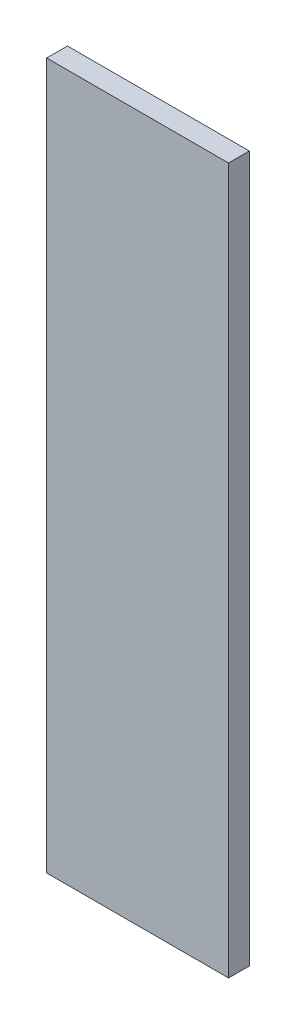
ISO-10303-21;
HEADER;
FILE_DESCRIPTION(('STEP AP214'),'2;1');
FILE_NAME('part.step','',(''),(''),'','','');
FILE_SCHEMA(('AUTOMOTIVE_DESIGN { 1 0 10303 214 1 1 1 1 }'));
ENDSEC;
DATA;
#1=APPLICATION_CONTEXT('core data for automotive mechanical design processes');
#2=APPLICATION_PROTOCOL_DEFINITION('international standard','automotive_design',2000,#1);
#3=PRODUCT_CONTEXT('',#1,'mechanical');
#4=PRODUCT('Part','Part','',(#3));
#5=PRODUCT_RELATED_PRODUCT_CATEGORY('part','',(#4));
#6=PRODUCT_DEFINITION_FORMATION('','',#4);
#7=PRODUCT_DEFINITION_CONTEXT('part definition',#1,'design');
#8=PRODUCT_DEFINITION('design','',#6,#7);
#9=PRODUCT_DEFINITION_SHAPE('','',#8);
#10=(LENGTH_UNIT() NAMED_UNIT(*) SI_UNIT(.MILLI.,.METRE.));
#11=(NAMED_UNIT(*) PLANE_ANGLE_UNIT() SI_UNIT($,.RADIAN.));
#12=(NAMED_UNIT(*) SI_UNIT($,.STERADIAN.) SOLID_ANGLE_UNIT());
#13=UNCERTAINTY_MEASURE_WITH_UNIT(LENGTH_MEASURE(1.E-05),#10,'distance_accuracy_value','');
#14=(GEOMETRIC_REPRESENTATION_CONTEXT(3) GLOBAL_UNCERTAINTY_ASSIGNED_CONTEXT((#13)) GLOBAL_UNIT_ASSIGNED_CONTEXT((#10,
#11,#12)) REPRESENTATION_CONTEXT('',''));
#15=CARTESIAN_POINT('',(0.,0.,0.));
#16=DIRECTION('',(0.,0.,1.));
#17=DIRECTION('',(1.,0.,0.));
#18=AXIS2_PLACEMENT_3D('',#15,#16,#17);
#19=CARTESIAN_POINT('',(-16.0086654272087,-617.707362756985,19.05));
#20=DIRECTION('',(0.,1.,0.));
#21=DIRECTION('',(0.,0.,1.));
#22=AXIS2_PLACEMENT_3D('',#19,#20,#21);
#23=PLANE('',#22);
#24=DIRECTION('',(1.,0.,0.));
#25=VECTOR('',#24,1.);
#26=CARTESIAN_POINT('',(-16.0086654272087,-617.707362756985,0.));
#27=LINE('',#26,#25);
#28=CARTESIAN_POINT('',(-16.0086654272087,-617.707362756985,0.));
#29=VERTEX_POINT('',#28);
#30=CARTESIAN_POINT('',(150.678834572791,-617.707362756985,0.));
#31=VERTEX_POINT('',#30);
#32=EDGE_CURVE('E106',#29,#31,#27,.T.);
#33=ORIENTED_EDGE('',*,*,#32,.T.);
#34=DIRECTION('',(0.,0.,-1.));
#35=VECTOR('',#34,1.);
#36=CARTESIAN_POINT('',(150.678834572791,-617.707362756985,19.05));
#37=LINE('',#36,#35);
#38=CARTESIAN_POINT('',(150.678834572791,-617.707362756985,19.05));
#39=VERTEX_POINT('',#38);
#40=EDGE_CURVE('E11',#39,#31,#37,.T.);
#41=ORIENTED_EDGE('',*,*,#40,.F.);
#42=DIRECTION('',(1.,0.,0.));
#43=VECTOR('',#42,1.);
#44=CARTESIAN_POINT('',(-16.0086654272087,-617.707362756985,19.05));
#45=LINE('',#44,#43);
#46=CARTESIAN_POINT('',(-16.0086654272087,-617.707362756985,19.05));
#47=VERTEX_POINT('',#46);
#48=EDGE_CURVE('E79',#47,#39,#45,.T.);
#49=ORIENTED_EDGE('',*,*,#48,.F.);
#50=DIRECTION('',(0.,0.,-1.));
#51=VECTOR('',#50,1.);
#52=CARTESIAN_POINT('',(-16.0086654272087,-617.707362756985,19.05));
#53=LINE('',#52,#51);
#54=EDGE_CURVE('E102',#47,#29,#53,.T.);
#55=ORIENTED_EDGE('',*,*,#54,.T.);
#56=EDGE_LOOP('',(#33,#41,#49,#55));
#57=FACE_BOUND('',#56,.T.);
#58=ADVANCED_FACE('F39',(#57),#23,.F.);
#59=CARTESIAN_POINT('',(150.678834572791,29.2306372430146,19.05));
#60=DIRECTION('',(1.,0.,0.));
#61=DIRECTION('',(0.,1.,0.));
#62=AXIS2_PLACEMENT_3D('',#59,#60,#61);
#63=PLANE('',#62);
#64=DIRECTION('',(0.,-1.,0.));
#65=VECTOR('',#64,1.);
#66=CARTESIAN_POINT('',(150.678834572791,29.2306372430146,0.));
#67=LINE('',#66,#65);
#68=CARTESIAN_POINT('',(150.678834572791,29.2306372430146,0.));
#69=VERTEX_POINT('',#68);
#70=EDGE_CURVE('E88',#69,#31,#67,.T.);
#71=ORIENTED_EDGE('',*,*,#70,.F.);
#72=DIRECTION('',(0.,0.,-1.));
#73=VECTOR('',#72,1.);
#74=CARTESIAN_POINT('',(150.678834572791,29.2306372430146,19.05));
#75=LINE('',#74,#73);
#76=CARTESIAN_POINT('',(150.678834572791,29.2306372430146,19.05));
#77=VERTEX_POINT('',#76);
#78=EDGE_CURVE('E48',#77,#69,#75,.T.);
#79=ORIENTED_EDGE('',*,*,#78,.F.);
#80=DIRECTION('',(0.,-1.,0.));
#81=VECTOR('',#80,1.);
#82=CARTESIAN_POINT('',(150.678834572791,29.2306372430146,19.05));
#83=LINE('',#82,#81);
#84=EDGE_CURVE('E86',#77,#39,#83,.T.);
#85=ORIENTED_EDGE('',*,*,#84,.T.);
#86=ORIENTED_EDGE('',*,*,#40,.T.);
#87=EDGE_LOOP('',(#71,#79,#85,#86));
#88=FACE_BOUND('',#87,.T.);
#89=ADVANCED_FACE('F85',(#88),#63,.T.);
#90=CARTESIAN_POINT('',(-16.0086654272088,29.2306372430146,19.05));
#91=DIRECTION('',(0.,1.,0.));
#92=DIRECTION('',(0.,0.,1.));
#93=AXIS2_PLACEMENT_3D('',#90,#91,#92);
#94=PLANE('',#93);
#95=DIRECTION('',(1.,0.,0.));
#96=VECTOR('',#95,1.);
#97=CARTESIAN_POINT('',(-16.0086654272088,29.2306372430146,0.));
#98=LINE('',#97,#96);
#99=CARTESIAN_POINT('',(-16.0086654272088,29.2306372430146,0.));
#100=VERTEX_POINT('',#99);
#101=EDGE_CURVE('E112',#100,#69,#98,.T.);
#102=ORIENTED_EDGE('',*,*,#101,.F.);
#103=DIRECTION('',(0.,0.,-1.));
#104=VECTOR('',#103,1.);
#105=CARTESIAN_POINT('',(-16.0086654272088,29.2306372430146,19.05));
#106=LINE('',#105,#104);
#107=CARTESIAN_POINT('',(-16.0086654272088,29.2306372430146,19.05));
#108=VERTEX_POINT('',#107);
#109=EDGE_CURVE('E71',#108,#100,#106,.T.);
#110=ORIENTED_EDGE('',*,*,#109,.F.);
#111=DIRECTION('',(1.,0.,0.));
#112=VECTOR('',#111,1.);
#113=CARTESIAN_POINT('',(-16.0086654272088,29.2306372430146,19.05));
#114=LINE('',#113,#112);
#115=EDGE_CURVE('E95',#108,#77,#114,.T.);
#116=ORIENTED_EDGE('',*,*,#115,.T.);
#117=ORIENTED_EDGE('',*,*,#78,.T.);
#118=EDGE_LOOP('',(#102,#110,#116,#117));
#119=FACE_BOUND('',#118,.T.);
#120=ADVANCED_FACE('F98',(#119),#94,.T.);
#121=CARTESIAN_POINT('',(-16.0086654272088,29.2306372430146,19.05));
#122=DIRECTION('',(1.,0.,0.));
#123=DIRECTION('',(0.,1.,0.));
#124=AXIS2_PLACEMENT_3D('',#121,#122,#123);
#125=PLANE('',#124);
#126=DIRECTION('',(0.,-1.,0.));
#127=VECTOR('',#126,1.);
#128=CARTESIAN_POINT('',(-16.0086654272088,29.2306372430146,0.));
#129=LINE('',#128,#127);
#130=EDGE_CURVE('E74',#100,#29,#129,.T.);
#131=ORIENTED_EDGE('',*,*,#130,.T.);
#132=ORIENTED_EDGE('',*,*,#54,.F.);
#133=DIRECTION('',(0.,-1.,0.));
#134=VECTOR('',#133,1.);
#135=CARTESIAN_POINT('',(-16.0086654272088,29.2306372430146,19.05));
#136=LINE('',#135,#134);
#137=EDGE_CURVE('E56',#108,#47,#136,.T.);
#138=ORIENTED_EDGE('',*,*,#137,.F.);
#139=ORIENTED_EDGE('',*,*,#109,.T.);
#140=EDGE_LOOP('',(#131,#132,#138,#139));
#141=FACE_BOUND('',#140,.T.);
#142=ADVANCED_FACE('F129',(#141),#125,.F.);
#143=CARTESIAN_POINT('',(0.,0.,19.05));
#144=DIRECTION('',(0.,0.,-1.));
#145=DIRECTION('',(-1.,0.,0.));
#146=AXIS2_PLACEMENT_3D('',#143,#144,#145);
#147=PLANE('',#146);
#148=ORIENTED_EDGE('',*,*,#48,.T.);
#149=ORIENTED_EDGE('',*,*,#84,.F.);
#150=ORIENTED_EDGE('',*,*,#115,.F.);
#151=ORIENTED_EDGE('',*,*,#137,.T.);
#152=EDGE_LOOP('',(#148,#149,#150,#151));
#153=FACE_BOUND('',#152,.T.);
#154=ADVANCED_FACE('F94',(#153),#147,.F.);
#155=CARTESIAN_POINT('',(0.,0.,0.));
#156=DIRECTION('',(0.,0.,-1.));
#157=DIRECTION('',(-1.,0.,0.));
#158=AXIS2_PLACEMENT_3D('',#155,#156,#157);
#159=PLANE('',#158);
#160=ORIENTED_EDGE('',*,*,#32,.F.);
#161=ORIENTED_EDGE('',*,*,#130,.F.);
#162=ORIENTED_EDGE('',*,*,#101,.T.);
#163=ORIENTED_EDGE('',*,*,#70,.T.);
#164=EDGE_LOOP('',(#160,#161,#162,#163));
#165=FACE_BOUND('',#164,.T.);
#166=ADVANCED_FACE('F123',(#165),#159,.T.);
#167=CLOSED_SHELL('',(#58,#89,#120,#142,#154,#166));
#168=MANIFOLD_SOLID_BREP('B2',#167);
#169=ADVANCED_BREP_SHAPE_REPRESENTATION('',(#18,#168),#14);
#170=SHAPE_DEFINITION_REPRESENTATION(#9,#169);
ENDSEC;
END-ISO-10303-21;
